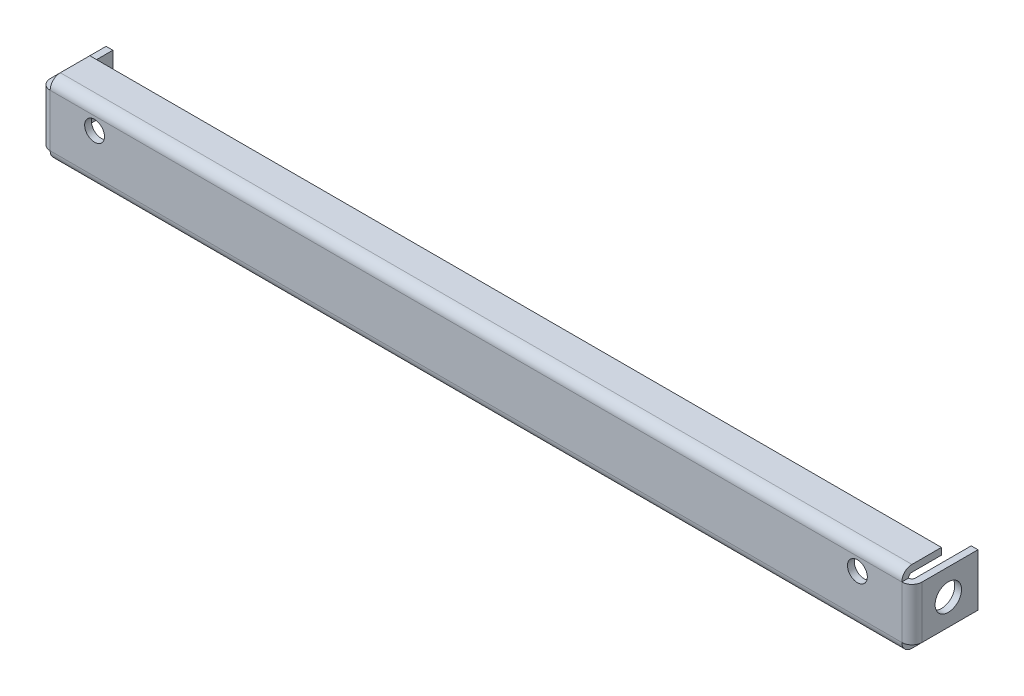
ISO-10303-21;
HEADER;
FILE_DESCRIPTION(('STEP AP214'),'2;1');
FILE_NAME('part.step','',(''),(''),'','','');
FILE_SCHEMA(('AUTOMOTIVE_DESIGN { 1 0 10303 214 1 1 1 1 }'));
ENDSEC;
DATA;
#1=APPLICATION_CONTEXT('core data for automotive mechanical design processes');
#2=APPLICATION_PROTOCOL_DEFINITION('international standard','automotive_design',2000,#1);
#3=PRODUCT_CONTEXT('',#1,'mechanical');
#4=PRODUCT('Part','Part','',(#3));
#5=PRODUCT_RELATED_PRODUCT_CATEGORY('part','',(#4));
#6=PRODUCT_DEFINITION_FORMATION('','',#4);
#7=PRODUCT_DEFINITION_CONTEXT('part definition',#1,'design');
#8=PRODUCT_DEFINITION('design','',#6,#7);
#9=PRODUCT_DEFINITION_SHAPE('','',#8);
#10=(LENGTH_UNIT() NAMED_UNIT(*) SI_UNIT(.MILLI.,.METRE.));
#11=(NAMED_UNIT(*) PLANE_ANGLE_UNIT() SI_UNIT($,.RADIAN.));
#12=(NAMED_UNIT(*) SI_UNIT($,.STERADIAN.) SOLID_ANGLE_UNIT());
#13=UNCERTAINTY_MEASURE_WITH_UNIT(LENGTH_MEASURE(1.E-05),#10,'distance_accuracy_value','');
#14=(GEOMETRIC_REPRESENTATION_CONTEXT(3) GLOBAL_UNCERTAINTY_ASSIGNED_CONTEXT((#13)) GLOBAL_UNIT_ASSIGNED_CONTEXT((#10,
#11,#12)) REPRESENTATION_CONTEXT('',''));
#15=CARTESIAN_POINT('',(0.,0.,0.));
#16=DIRECTION('',(0.,0.,1.));
#17=DIRECTION('',(1.,0.,0.));
#18=AXIS2_PLACEMENT_3D('',#15,#16,#17);
#19=CARTESIAN_POINT('',(104.775,-6.29285,-15.875));
#20=DIRECTION('',(0.,0.,1.));
#21=DIRECTION('',(1.,0.,0.));
#22=AXIS2_PLACEMENT_3D('',#19,#20,#21);
#23=PLANE('',#22);
#24=DIRECTION('',(1.,0.,0.));
#25=VECTOR('',#24,1.);
#26=CARTESIAN_POINT('',(104.775,6.29285,-15.875));
#27=LINE('',#26,#25);
#28=CARTESIAN_POINT('',(104.775,6.29285,-15.875));
#29=VERTEX_POINT('',#28);
#30=CARTESIAN_POINT('',(103.1494,6.29285,-15.875));
#31=VERTEX_POINT('',#30);
#32=EDGE_CURVE('E274',#29,#31,#27,.F.);
#33=ORIENTED_EDGE('',*,*,#32,.F.);
#34=DIRECTION('',(0.,1.,0.));
#35=VECTOR('',#34,1.);
#36=CARTESIAN_POINT('',(104.775,6.29285,-15.875));
#37=LINE('',#36,#35);
#38=CARTESIAN_POINT('',(104.775,-6.29285,-15.875));
#39=VERTEX_POINT('',#38);
#40=EDGE_CURVE('E225',#39,#29,#37,.T.);
#41=ORIENTED_EDGE('',*,*,#40,.F.);
#42=DIRECTION('',(1.,0.,0.));
#43=VECTOR('',#42,1.);
#44=CARTESIAN_POINT('',(104.775,-6.29285,-15.875));
#45=LINE('',#44,#43);
#46=CARTESIAN_POINT('',(103.1494,-6.29285,-15.875));
#47=VERTEX_POINT('',#46);
#48=EDGE_CURVE('E265',#39,#47,#45,.F.);
#49=ORIENTED_EDGE('',*,*,#48,.T.);
#50=DIRECTION('',(0.,1.,0.));
#51=VECTOR('',#50,1.);
#52=CARTESIAN_POINT('',(103.1494,6.29285,-15.875));
#53=LINE('',#52,#51);
#54=EDGE_CURVE('E121',#47,#31,#53,.T.);
#55=ORIENTED_EDGE('',*,*,#54,.T.);
#56=EDGE_LOOP('',(#33,#41,#49,#55));
#57=FACE_BOUND('',#56,.T.);
#58=ADVANCED_FACE('F16',(#57),#23,.F.);
#59=CARTESIAN_POINT('',(-106.099742516144,0.,-8.7376));
#60=DIRECTION('',(-1.,0.,0.));
#61=DIRECTION('',(0.,0.,1.));
#62=AXIS2_PLACEMENT_3D('',#59,#60,#61);
#63=CYLINDRICAL_SURFACE('',#62,3.175);
#64=CARTESIAN_POINT('',(104.775,0.,-8.73760000000001));
#65=DIRECTION('',(-1.,0.,0.));
#66=DIRECTION('',(0.,0.,1.));
#67=AXIS2_PLACEMENT_3D('',#64,#65,#66);
#68=CIRCLE('',#67,3.175);
#69=CARTESIAN_POINT('',(104.775,0.,-5.56260000000001));
#70=VERTEX_POINT('',#69);
#71=EDGE_CURVE('E222',#70,#70,#68,.T.);
#72=ORIENTED_EDGE('',*,*,#71,.F.);
#73=EDGE_LOOP('',(#72));
#74=FACE_BOUND('',#73,.T.);
#75=CARTESIAN_POINT('',(103.1494,0.,-8.73760000000001));
#76=DIRECTION('',(-1.,0.,0.));
#77=DIRECTION('',(0.,0.,1.));
#78=AXIS2_PLACEMENT_3D('',#75,#76,#77);
#79=CIRCLE('',#78,3.175);
#80=CARTESIAN_POINT('',(103.1494,0.,-5.56260000000001));
#81=VERTEX_POINT('',#80);
#82=EDGE_CURVE('E19',#81,#81,#79,.T.);
#83=ORIENTED_EDGE('',*,*,#82,.T.);
#84=EDGE_LOOP('',(#83));
#85=FACE_BOUND('',#84,.T.);
#86=ADVANCED_FACE('F527',(#74,#85),#63,.F.);
#87=CARTESIAN_POINT('',(103.1494,6.29285,-1.38393774617543));
#88=DIRECTION('',(1.,0.,0.));
#89=DIRECTION('',(0.,0.,-1.));
#90=AXIS2_PLACEMENT_3D('',#87,#88,#89);
#91=PLANE('',#90);
#92=ORIENTED_EDGE('',*,*,#82,.F.);
#93=EDGE_LOOP('',(#92));
#94=FACE_BOUND('',#93,.T.);
#95=DIRECTION('',(0.,0.,-1.));
#96=VECTOR('',#95,1.);
#97=CARTESIAN_POINT('',(103.1494,6.29285,-1.38393774617543));
#98=LINE('',#97,#96);
#99=CARTESIAN_POINT('',(103.1494,6.29285,-2.4384));
#100=VERTEX_POINT('',#99);
#101=EDGE_CURVE('E220',#100,#31,#98,.T.);
#102=ORIENTED_EDGE('',*,*,#101,.T.);
#103=ORIENTED_EDGE('',*,*,#54,.F.);
#104=DIRECTION('',(0.,0.,1.));
#105=VECTOR('',#104,1.);
#106=CARTESIAN_POINT('',(103.1494,-6.29285,-1.38393774617543));
#107=LINE('',#106,#105);
#108=CARTESIAN_POINT('',(103.1494,-6.29285,-2.4384));
#109=VERTEX_POINT('',#108);
#110=EDGE_CURVE('E229',#47,#109,#107,.T.);
#111=ORIENTED_EDGE('',*,*,#110,.T.);
#112=DIRECTION('',(0.,-1.,0.));
#113=VECTOR('',#112,1.);
#114=CARTESIAN_POINT('',(103.1494,-6.29285,-2.4384));
#115=LINE('',#114,#113);
#116=EDGE_CURVE('E110',#109,#100,#115,.F.);
#117=ORIENTED_EDGE('',*,*,#116,.T.);
#118=EDGE_LOOP('',(#102,#103,#111,#117));
#119=FACE_BOUND('',#118,.T.);
#120=ADVANCED_FACE('F525',(#94,#119),#91,.F.);
#121=CARTESIAN_POINT('',(-104.775,-8.73125,-9.525));
#122=DIRECTION('',(0.,0.,1.));
#123=DIRECTION('',(0.,-1.,0.));
#124=AXIS2_PLACEMENT_3D('',#121,#122,#123);
#125=PLANE('',#124);
#126=DIRECTION('',(1.,0.,0.));
#127=VECTOR('',#126,1.);
#128=CARTESIAN_POINT('',(-104.775,-7.10565,-9.525));
#129=LINE('',#128,#127);
#130=CARTESIAN_POINT('',(102.3366,-7.10565,-9.525));
#131=VERTEX_POINT('',#130);
#132=CARTESIAN_POINT('',(-102.3366,-7.10565,-9.525));
#133=VERTEX_POINT('',#132);
#134=EDGE_CURVE('E240',#131,#133,#129,.F.);
#135=ORIENTED_EDGE('',*,*,#134,.F.);
#136=DIRECTION('',(0.,-1.,0.));
#137=VECTOR('',#136,1.);
#138=CARTESIAN_POINT('',(102.3366,-8.73125,-9.525));
#139=LINE('',#138,#137);
#140=CARTESIAN_POINT('',(102.3366,-8.73125,-9.525));
#141=VERTEX_POINT('',#140);
#142=EDGE_CURVE('E244',#141,#131,#139,.F.);
#143=ORIENTED_EDGE('',*,*,#142,.F.);
#144=DIRECTION('',(1.,0.,0.));
#145=VECTOR('',#144,1.);
#146=CARTESIAN_POINT('',(-104.775,-8.73125,-9.525));
#147=LINE('',#146,#145);
#148=CARTESIAN_POINT('',(-102.3366,-8.73125,-9.525));
#149=VERTEX_POINT('',#148);
#150=EDGE_CURVE('E216',#141,#149,#147,.F.);
#151=ORIENTED_EDGE('',*,*,#150,.T.);
#152=DIRECTION('',(0.,1.,0.));
#153=VECTOR('',#152,1.);
#154=CARTESIAN_POINT('',(-102.3366,-6.29285,-9.525));
#155=LINE('',#154,#153);
#156=EDGE_CURVE('E266',#149,#133,#155,.T.);
#157=ORIENTED_EDGE('',*,*,#156,.T.);
#158=EDGE_LOOP('',(#135,#143,#151,#157));
#159=FACE_BOUND('',#158,.T.);
#160=ADVANCED_FACE('F521',(#159),#125,.F.);
#161=CARTESIAN_POINT('',(-91.6686,202.143492516144,-5.5626));
#162=DIRECTION('',(0.,1.,0.));
#163=DIRECTION('',(0.,0.,1.));
#164=AXIS2_PLACEMENT_3D('',#161,#162,#163);
#165=CYLINDRICAL_SURFACE('',#164,2.38125);
#166=CARTESIAN_POINT('',(-91.6686,-7.10564999999999,-5.5626));
#167=DIRECTION('',(0.,1.,0.));
#168=DIRECTION('',(0.,0.,1.));
#169=AXIS2_PLACEMENT_3D('',#166,#167,#168);
#170=CIRCLE('',#169,2.38125);
#171=CARTESIAN_POINT('',(-91.6686,-7.10564999999999,-3.18135));
#172=VERTEX_POINT('',#171);
#173=EDGE_CURVE('E235',#172,#172,#170,.F.);
#174=ORIENTED_EDGE('',*,*,#173,.F.);
#175=EDGE_LOOP('',(#174));
#176=FACE_BOUND('',#175,.T.);
#177=CARTESIAN_POINT('',(-91.6686,-8.73125,-5.5626));
#178=DIRECTION('',(0.,1.,0.));
#179=DIRECTION('',(0.,0.,1.));
#180=AXIS2_PLACEMENT_3D('',#177,#178,#179);
#181=CIRCLE('',#180,2.38125);
#182=CARTESIAN_POINT('',(-91.6686,-8.73125,-3.18135));
#183=VERTEX_POINT('',#182);
#184=EDGE_CURVE('E210',#183,#183,#181,.F.);
#185=ORIENTED_EDGE('',*,*,#184,.T.);
#186=EDGE_LOOP('',(#185));
#187=FACE_BOUND('',#186,.T.);
#188=ADVANCED_FACE('F514',(#176,#187),#165,.F.);
#189=CARTESIAN_POINT('',(91.6686,202.143492516144,-5.5626));
#190=DIRECTION('',(0.,1.,0.));
#191=DIRECTION('',(0.,0.,1.));
#192=AXIS2_PLACEMENT_3D('',#189,#190,#191);
#193=CYLINDRICAL_SURFACE('',#192,2.38125);
#194=CARTESIAN_POINT('',(91.6686,-7.10564999999999,-5.5626));
#195=DIRECTION('',(0.,1.,0.));
#196=DIRECTION('',(0.,0.,1.));
#197=AXIS2_PLACEMENT_3D('',#194,#195,#196);
#198=CIRCLE('',#197,2.38125);
#199=CARTESIAN_POINT('',(91.6686,-7.10564999999999,-3.18135));
#200=VERTEX_POINT('',#199);
#201=EDGE_CURVE('E238',#200,#200,#198,.F.);
#202=ORIENTED_EDGE('',*,*,#201,.F.);
#203=EDGE_LOOP('',(#202));
#204=FACE_BOUND('',#203,.T.);
#205=CARTESIAN_POINT('',(91.6686,-8.73125,-5.5626));
#206=DIRECTION('',(0.,1.,0.));
#207=DIRECTION('',(0.,0.,1.));
#208=AXIS2_PLACEMENT_3D('',#205,#206,#207);
#209=CIRCLE('',#208,2.38125);
#210=CARTESIAN_POINT('',(91.6686,-8.73125,-3.18135));
#211=VERTEX_POINT('',#210);
#212=EDGE_CURVE('E207',#211,#211,#209,.F.);
#213=ORIENTED_EDGE('',*,*,#212,.T.);
#214=EDGE_LOOP('',(#213));
#215=FACE_BOUND('',#214,.T.);
#216=ADVANCED_FACE('F504',(#204,#215),#193,.F.);
#217=CARTESIAN_POINT('',(-104.775,-7.10565,0.));
#218=DIRECTION('',(0.,1.,0.));
#219=DIRECTION('',(0.,0.,1.));
#220=AXIS2_PLACEMENT_3D('',#217,#218,#219);
#221=PLANE('',#220);
#222=ORIENTED_EDGE('',*,*,#173,.T.);
#223=EDGE_LOOP('',(#222));
#224=FACE_BOUND('',#223,.T.);
#225=ORIENTED_EDGE('',*,*,#201,.T.);
#226=EDGE_LOOP('',(#225));
#227=FACE_BOUND('',#226,.T.);
#228=DIRECTION('',(0.,0.,-1.));
#229=VECTOR('',#228,1.);
#230=CARTESIAN_POINT('',(102.3366,-7.10565,-2.4384));
#231=LINE('',#230,#229);
#232=CARTESIAN_POINT('',(102.3366,-7.10565,-2.4384));
#233=VERTEX_POINT('',#232);
#234=EDGE_CURVE('E345',#131,#233,#231,.F.);
#235=ORIENTED_EDGE('',*,*,#234,.F.);
#236=ORIENTED_EDGE('',*,*,#134,.T.);
#237=DIRECTION('',(0.,0.,-1.));
#238=VECTOR('',#237,1.);
#239=CARTESIAN_POINT('',(-102.3366,-7.10565,-2.4384));
#240=LINE('',#239,#238);
#241=CARTESIAN_POINT('',(-102.3366,-7.10565,-2.4384));
#242=VERTEX_POINT('',#241);
#243=EDGE_CURVE('E217',#133,#242,#240,.F.);
#244=ORIENTED_EDGE('',*,*,#243,.T.);
#245=DIRECTION('',(-1.,0.,0.));
#246=VECTOR('',#245,1.);
#247=CARTESIAN_POINT('',(-104.775,-7.10565,-2.4384));
#248=LINE('',#247,#246);
#249=EDGE_CURVE('E263',#242,#233,#248,.F.);
#250=ORIENTED_EDGE('',*,*,#249,.T.);
#251=EDGE_LOOP('',(#235,#236,#244,#250));
#252=FACE_BOUND('',#251,.T.);
#253=ADVANCED_FACE('F502',(#224,#227,#252),#221,.T.);
#254=CARTESIAN_POINT('',(-104.775,6.29285,-15.875));
#255=DIRECTION('',(0.,0.,1.));
#256=DIRECTION('',(1.,0.,0.));
#257=AXIS2_PLACEMENT_3D('',#254,#255,#256);
#258=PLANE('',#257);
#259=DIRECTION('',(1.,0.,0.));
#260=VECTOR('',#259,1.);
#261=CARTESIAN_POINT('',(-104.775,-6.29285,-15.875));
#262=LINE('',#261,#260);
#263=CARTESIAN_POINT('',(-104.775,-6.29285,-15.875));
#264=VERTEX_POINT('',#263);
#265=CARTESIAN_POINT('',(-103.1494,-6.29285,-15.875));
#266=VERTEX_POINT('',#265);
#267=EDGE_CURVE('E237',#264,#266,#262,.T.);
#268=ORIENTED_EDGE('',*,*,#267,.F.);
#269=DIRECTION('',(0.,1.,0.));
#270=VECTOR('',#269,1.);
#271=CARTESIAN_POINT('',(-104.775,6.29285,-15.875));
#272=LINE('',#271,#270);
#273=CARTESIAN_POINT('',(-104.775,6.29285,-15.875));
#274=VERTEX_POINT('',#273);
#275=EDGE_CURVE('E201',#264,#274,#272,.T.);
#276=ORIENTED_EDGE('',*,*,#275,.T.);
#277=DIRECTION('',(1.,0.,0.));
#278=VECTOR('',#277,1.);
#279=CARTESIAN_POINT('',(-104.775,6.29285,-15.875));
#280=LINE('',#279,#278);
#281=CARTESIAN_POINT('',(-103.1494,6.29285,-15.875));
#282=VERTEX_POINT('',#281);
#283=EDGE_CURVE('E342',#274,#282,#280,.T.);
#284=ORIENTED_EDGE('',*,*,#283,.T.);
#285=DIRECTION('',(0.,1.,0.));
#286=VECTOR('',#285,1.);
#287=CARTESIAN_POINT('',(-103.1494,6.29285,-15.875));
#288=LINE('',#287,#286);
#289=EDGE_CURVE('E234',#266,#282,#288,.T.);
#290=ORIENTED_EDGE('',*,*,#289,.F.);
#291=EDGE_LOOP('',(#268,#276,#284,#290));
#292=FACE_BOUND('',#291,.T.);
#293=ADVANCED_FACE('F437',(#292),#258,.F.);
#294=CARTESIAN_POINT('',(106.099742516144,0.,-8.7376));
#295=DIRECTION('',(1.,0.,0.));
#296=DIRECTION('',(0.,0.,-1.));
#297=AXIS2_PLACEMENT_3D('',#294,#295,#296);
#298=CYLINDRICAL_SURFACE('',#297,3.175);
#299=CARTESIAN_POINT('',(-103.1494,0.,-8.73760000000001));
#300=DIRECTION('',(1.,0.,0.));
#301=DIRECTION('',(0.,0.,-1.));
#302=AXIS2_PLACEMENT_3D('',#299,#300,#301);
#303=CIRCLE('',#302,3.175);
#304=CARTESIAN_POINT('',(-103.1494,0.,-11.9126));
#305=VERTEX_POINT('',#304);
#306=EDGE_CURVE('E230',#305,#305,#303,.F.);
#307=ORIENTED_EDGE('',*,*,#306,.F.);
#308=EDGE_LOOP('',(#307));
#309=FACE_BOUND('',#308,.T.);
#310=CARTESIAN_POINT('',(-104.775,0.,-8.73760000000001));
#311=DIRECTION('',(1.,0.,0.));
#312=DIRECTION('',(0.,0.,-1.));
#313=AXIS2_PLACEMENT_3D('',#310,#311,#312);
#314=CIRCLE('',#313,3.175);
#315=CARTESIAN_POINT('',(-104.775,0.,-11.9126));
#316=VERTEX_POINT('',#315);
#317=EDGE_CURVE('E194',#316,#316,#314,.F.);
#318=ORIENTED_EDGE('',*,*,#317,.T.);
#319=EDGE_LOOP('',(#318));
#320=FACE_BOUND('',#319,.T.);
#321=ADVANCED_FACE('F512',(#309,#320),#298,.F.);
#322=CARTESIAN_POINT('',(-103.1494,6.29285,-1.38393774617543));
#323=DIRECTION('',(1.,0.,0.));
#324=DIRECTION('',(0.,0.,-1.));
#325=AXIS2_PLACEMENT_3D('',#322,#323,#324);
#326=PLANE('',#325);
#327=ORIENTED_EDGE('',*,*,#306,.T.);
#328=EDGE_LOOP('',(#327));
#329=FACE_BOUND('',#328,.T.);
#330=DIRECTION('',(0.,0.,1.));
#331=VECTOR('',#330,1.);
#332=CARTESIAN_POINT('',(-103.1494,-6.29285,-15.875));
#333=LINE('',#332,#331);
#334=CARTESIAN_POINT('',(-103.1494,-6.29285,-2.4384));
#335=VERTEX_POINT('',#334);
#336=EDGE_CURVE('E192',#335,#266,#333,.F.);
#337=ORIENTED_EDGE('',*,*,#336,.T.);
#338=ORIENTED_EDGE('',*,*,#289,.T.);
#339=DIRECTION('',(0.,0.,-1.));
#340=VECTOR('',#339,1.);
#341=CARTESIAN_POINT('',(-103.1494,6.29285,-1.38393774617543));
#342=LINE('',#341,#340);
#343=CARTESIAN_POINT('',(-103.1494,6.29285,-2.4384));
#344=VERTEX_POINT('',#343);
#345=EDGE_CURVE('E202',#282,#344,#342,.F.);
#346=ORIENTED_EDGE('',*,*,#345,.T.);
#347=DIRECTION('',(0.,1.,0.));
#348=VECTOR('',#347,1.);
#349=CARTESIAN_POINT('',(-103.1494,6.29285,-2.4384));
#350=LINE('',#349,#348);
#351=EDGE_CURVE('E384',#344,#335,#350,.F.);
#352=ORIENTED_EDGE('',*,*,#351,.T.);
#353=EDGE_LOOP('',(#337,#338,#346,#352));
#354=FACE_BOUND('',#353,.T.);
#355=ADVANCED_FACE('F441',(#329,#354),#326,.T.);
#356=CARTESIAN_POINT('',(-104.775,8.73125,-9.525));
#357=DIRECTION('',(0.,0.,-1.));
#358=DIRECTION('',(0.,1.,0.));
#359=AXIS2_PLACEMENT_3D('',#356,#357,#358);
#360=PLANE('',#359);
#361=DIRECTION('',(0.,1.,0.));
#362=VECTOR('',#361,1.);
#363=CARTESIAN_POINT('',(102.3366,8.73125,-9.525));
#364=LINE('',#363,#362);
#365=CARTESIAN_POINT('',(102.3366,8.73125,-9.525));
#366=VERTEX_POINT('',#365);
#367=CARTESIAN_POINT('',(102.3366,7.10565,-9.525));
#368=VERTEX_POINT('',#367);
#369=EDGE_CURVE('E385',#366,#368,#364,.F.);
#370=ORIENTED_EDGE('',*,*,#369,.T.);
#371=DIRECTION('',(1.,0.,0.));
#372=VECTOR('',#371,1.);
#373=CARTESIAN_POINT('',(-104.775,7.10565,-9.525));
#374=LINE('',#373,#372);
#375=CARTESIAN_POINT('',(-102.3366,7.10565,-9.525));
#376=VERTEX_POINT('',#375);
#377=EDGE_CURVE('E381',#376,#368,#374,.T.);
#378=ORIENTED_EDGE('',*,*,#377,.F.);
#379=DIRECTION('',(0.,1.,0.));
#380=VECTOR('',#379,1.);
#381=CARTESIAN_POINT('',(-102.3366,8.73125,-9.525));
#382=LINE('',#381,#380);
#383=CARTESIAN_POINT('',(-102.3366,8.73125,-9.525));
#384=VERTEX_POINT('',#383);
#385=EDGE_CURVE('E233',#376,#384,#382,.T.);
#386=ORIENTED_EDGE('',*,*,#385,.T.);
#387=DIRECTION('',(1.,0.,0.));
#388=VECTOR('',#387,1.);
#389=CARTESIAN_POINT('',(-104.775,8.73125,-9.525));
#390=LINE('',#389,#388);
#391=EDGE_CURVE('E154',#384,#366,#390,.T.);
#392=ORIENTED_EDGE('',*,*,#391,.T.);
#393=EDGE_LOOP('',(#370,#378,#386,#392));
#394=FACE_BOUND('',#393,.T.);
#395=ADVANCED_FACE('F561',(#394),#360,.T.);
#396=CARTESIAN_POINT('',(-104.775,7.10565,0.));
#397=DIRECTION('',(0.,-1.,0.));
#398=DIRECTION('',(0.,0.,-1.));
#399=AXIS2_PLACEMENT_3D('',#396,#397,#398);
#400=PLANE('',#399);
#401=DIRECTION('',(0.,0.,-1.));
#402=VECTOR('',#401,1.);
#403=CARTESIAN_POINT('',(102.3366,7.10565,-2.4384));
#404=LINE('',#403,#402);
#405=CARTESIAN_POINT('',(102.3366,7.10565,-2.4384));
#406=VERTEX_POINT('',#405);
#407=EDGE_CURVE('E184',#406,#368,#404,.T.);
#408=ORIENTED_EDGE('',*,*,#407,.F.);
#409=DIRECTION('',(-1.,0.,0.));
#410=VECTOR('',#409,1.);
#411=CARTESIAN_POINT('',(-104.775,7.10565,-2.4384));
#412=LINE('',#411,#410);
#413=CARTESIAN_POINT('',(-102.3366,7.10565,-2.4384));
#414=VERTEX_POINT('',#413);
#415=EDGE_CURVE('E278',#406,#414,#412,.T.);
#416=ORIENTED_EDGE('',*,*,#415,.T.);
#417=DIRECTION('',(0.,0.,-1.));
#418=VECTOR('',#417,1.);
#419=CARTESIAN_POINT('',(-102.3366,7.10565,-2.4384));
#420=LINE('',#419,#418);
#421=EDGE_CURVE('E156',#414,#376,#420,.T.);
#422=ORIENTED_EDGE('',*,*,#421,.T.);
#423=ORIENTED_EDGE('',*,*,#377,.T.);
#424=EDGE_LOOP('',(#408,#416,#422,#423));
#425=FACE_BOUND('',#424,.T.);
#426=ADVANCED_FACE('F558',(#425),#400,.T.);
#427=CARTESIAN_POINT('',(-102.3366,6.29285,-2.4384));
#428=DIRECTION('',(0.,1.,0.));
#429=DIRECTION('',(0.,0.,1.));
#430=AXIS2_PLACEMENT_3D('',#427,#428,#429);
#431=CYLINDRICAL_SURFACE('',#430,0.8128);
#432=CARTESIAN_POINT('',(-102.3366,-6.29285,-2.4384));
#433=DIRECTION('',(0.,1.,0.));
#434=DIRECTION('',(0.,0.,1.));
#435=AXIS2_PLACEMENT_3D('',#432,#433,#434);
#436=CIRCLE('',#435,0.8128);
#437=CARTESIAN_POINT('',(-102.3366,-6.29285,-1.6256));
#438=VERTEX_POINT('',#437);
#439=EDGE_CURVE('E189',#438,#335,#436,.F.);
#440=ORIENTED_EDGE('',*,*,#439,.T.);
#441=ORIENTED_EDGE('',*,*,#351,.F.);
#442=CARTESIAN_POINT('',(-102.3366,6.29285,-2.4384));
#443=DIRECTION('',(0.,1.,0.));
#444=DIRECTION('',(0.,0.,1.));
#445=AXIS2_PLACEMENT_3D('',#442,#443,#444);
#446=CIRCLE('',#445,0.8128);
#447=CARTESIAN_POINT('',(-102.3366,6.29285,-1.6256));
#448=VERTEX_POINT('',#447);
#449=EDGE_CURVE('E199',#344,#448,#446,.T.);
#450=ORIENTED_EDGE('',*,*,#449,.T.);
#451=DIRECTION('',(0.,1.,0.));
#452=VECTOR('',#451,1.);
#453=CARTESIAN_POINT('',(-102.3366,8.73125,-1.6256));
#454=LINE('',#453,#452);
#455=EDGE_CURVE('E392',#438,#448,#454,.T.);
#456=ORIENTED_EDGE('',*,*,#455,.F.);
#457=EDGE_LOOP('',(#440,#441,#450,#456));
#458=FACE_BOUND('',#457,.T.);
#459=ADVANCED_FACE('F492',(#458),#431,.F.);
#460=CARTESIAN_POINT('',(-104.775,6.29285,-2.4384));
#461=DIRECTION('',(-1.,0.,0.));
#462=DIRECTION('',(0.,0.,1.));
#463=AXIS2_PLACEMENT_3D('',#460,#461,#462);
#464=CYLINDRICAL_SURFACE('',#463,0.8128);
#465=ORIENTED_EDGE('',*,*,#415,.F.);
#466=CARTESIAN_POINT('',(102.3366,6.29285,-2.4384));
#467=DIRECTION('',(-1.,0.,0.));
#468=DIRECTION('',(0.,0.,1.));
#469=AXIS2_PLACEMENT_3D('',#466,#467,#468);
#470=CIRCLE('',#469,0.8128);
#471=CARTESIAN_POINT('',(102.3366,6.29285,-1.6256));
#472=VERTEX_POINT('',#471);
#473=EDGE_CURVE('E181',#472,#406,#470,.T.);
#474=ORIENTED_EDGE('',*,*,#473,.F.);
#475=DIRECTION('',(-1.,0.,0.));
#476=VECTOR('',#475,1.);
#477=CARTESIAN_POINT('',(-104.775,6.29285,-1.6256));
#478=LINE('',#477,#476);
#479=EDGE_CURVE('E388',#448,#472,#478,.F.);
#480=ORIENTED_EDGE('',*,*,#479,.F.);
#481=CARTESIAN_POINT('',(-102.3366,6.29285,-2.4384));
#482=DIRECTION('',(-1.,0.,0.));
#483=DIRECTION('',(0.,0.,1.));
#484=AXIS2_PLACEMENT_3D('',#481,#482,#483);
#485=CIRCLE('',#484,0.8128);
#486=EDGE_CURVE('E186',#448,#414,#485,.T.);
#487=ORIENTED_EDGE('',*,*,#486,.T.);
#488=EDGE_LOOP('',(#465,#474,#480,#487));
#489=FACE_BOUND('',#488,.T.);
#490=ADVANCED_FACE('F497',(#489),#464,.F.);
#491=CARTESIAN_POINT('',(102.3366,-6.29285,-2.4384));
#492=DIRECTION('',(0.,-1.,0.));
#493=DIRECTION('',(0.,0.,-1.));
#494=AXIS2_PLACEMENT_3D('',#491,#492,#493);
#495=CYLINDRICAL_SURFACE('',#494,0.8128);
#496=CARTESIAN_POINT('',(102.3366,6.29285,-2.4384));
#497=DIRECTION('',(0.,-1.,0.));
#498=DIRECTION('',(0.,0.,-1.));
#499=AXIS2_PLACEMENT_3D('',#496,#497,#498);
#500=CIRCLE('',#499,0.8128);
#501=EDGE_CURVE('E218',#472,#100,#500,.F.);
#502=ORIENTED_EDGE('',*,*,#501,.T.);
#503=ORIENTED_EDGE('',*,*,#116,.F.);
#504=CARTESIAN_POINT('',(102.3366,-6.29285,-2.4384));
#505=DIRECTION('',(0.,-1.,0.));
#506=DIRECTION('',(0.,0.,-1.));
#507=AXIS2_PLACEMENT_3D('',#504,#505,#506);
#508=CIRCLE('',#507,0.8128);
#509=CARTESIAN_POINT('',(102.3366,-6.29285,-1.6256));
#510=VERTEX_POINT('',#509);
#511=EDGE_CURVE('E226',#109,#510,#508,.T.);
#512=ORIENTED_EDGE('',*,*,#511,.T.);
#513=DIRECTION('',(0.,1.,0.));
#514=VECTOR('',#513,1.);
#515=CARTESIAN_POINT('',(102.3366,8.73125,-1.6256));
#516=LINE('',#515,#514);
#517=EDGE_CURVE('E391',#472,#510,#516,.F.);
#518=ORIENTED_EDGE('',*,*,#517,.F.);
#519=EDGE_LOOP('',(#502,#503,#512,#518));
#520=FACE_BOUND('',#519,.T.);
#521=ADVANCED_FACE('F545',(#520),#495,.F.);
#522=CARTESIAN_POINT('',(-104.775,-6.29285,-2.4384));
#523=DIRECTION('',(-1.,0.,0.));
#524=DIRECTION('',(0.,0.,1.));
#525=AXIS2_PLACEMENT_3D('',#522,#523,#524);
#526=CYLINDRICAL_SURFACE('',#525,0.8128);
#527=DIRECTION('',(-1.,0.,0.));
#528=VECTOR('',#527,1.);
#529=CARTESIAN_POINT('',(-104.775,-6.29285,-1.6256));
#530=LINE('',#529,#528);
#531=EDGE_CURVE('E180',#510,#438,#530,.T.);
#532=ORIENTED_EDGE('',*,*,#531,.F.);
#533=CARTESIAN_POINT('',(102.3366,-6.29285,-2.4384));
#534=DIRECTION('',(-1.,0.,0.));
#535=DIRECTION('',(0.,0.,1.));
#536=AXIS2_PLACEMENT_3D('',#533,#534,#535);
#537=CIRCLE('',#536,0.8128);
#538=EDGE_CURVE('E203',#233,#510,#537,.T.);
#539=ORIENTED_EDGE('',*,*,#538,.F.);
#540=ORIENTED_EDGE('',*,*,#249,.F.);
#541=CARTESIAN_POINT('',(-102.3366,-6.29285,-2.4384));
#542=DIRECTION('',(-1.,0.,0.));
#543=DIRECTION('',(0.,0.,1.));
#544=AXIS2_PLACEMENT_3D('',#541,#542,#543);
#545=CIRCLE('',#544,0.8128);
#546=EDGE_CURVE('E214',#242,#438,#545,.T.);
#547=ORIENTED_EDGE('',*,*,#546,.T.);
#548=EDGE_LOOP('',(#532,#539,#540,#547));
#549=FACE_BOUND('',#548,.T.);
#550=ADVANCED_FACE('F501',(#549),#526,.F.);
#551=CARTESIAN_POINT('',(104.775,-6.29285,-1.38393774617543));
#552=DIRECTION('',(0.,1.,0.));
#553=DIRECTION('',(0.,0.,1.));
#554=AXIS2_PLACEMENT_3D('',#551,#552,#553);
#555=PLANE('',#554);
#556=CARTESIAN_POINT('',(102.3366,-6.29285,-2.4384));
#557=DIRECTION('',(0.,-1.,0.));
#558=DIRECTION('',(0.,0.,-1.));
#559=AXIS2_PLACEMENT_3D('',#556,#557,#558);
#560=CIRCLE('',#559,2.4384);
#561=CARTESIAN_POINT('',(102.3366,-6.29285,0.));
#562=VERTEX_POINT('',#561);
#563=CARTESIAN_POINT('',(104.775,-6.29285,-2.4384));
#564=VERTEX_POINT('',#563);
#565=EDGE_CURVE('E178',#562,#564,#560,.F.);
#566=ORIENTED_EDGE('',*,*,#565,.F.);
#567=DIRECTION('',(0.,0.,-1.));
#568=VECTOR('',#567,1.);
#569=CARTESIAN_POINT('',(102.3366,-6.29285,-2.4384));
#570=LINE('',#569,#568);
#571=EDGE_CURVE('E206',#510,#562,#570,.F.);
#572=ORIENTED_EDGE('',*,*,#571,.F.);
#573=ORIENTED_EDGE('',*,*,#511,.F.);
#574=ORIENTED_EDGE('',*,*,#110,.F.);
#575=ORIENTED_EDGE('',*,*,#48,.F.);
#576=DIRECTION('',(0.,0.,-1.));
#577=VECTOR('',#576,1.);
#578=CARTESIAN_POINT('',(104.775,-6.29285,-1.38393774617543));
#579=LINE('',#578,#577);
#580=EDGE_CURVE('E228',#564,#39,#579,.T.);
#581=ORIENTED_EDGE('',*,*,#580,.F.);
#582=EDGE_LOOP('',(#566,#572,#573,#574,#575,#581));
#583=FACE_BOUND('',#582,.T.);
#584=ADVANCED_FACE('F472',(#583),#555,.F.);
#585=CARTESIAN_POINT('',(104.775,6.29285,-1.38393774617543));
#586=DIRECTION('',(1.,0.,0.));
#587=DIRECTION('',(0.,0.,-1.));
#588=AXIS2_PLACEMENT_3D('',#585,#586,#587);
#589=PLANE('',#588);
#590=ORIENTED_EDGE('',*,*,#71,.T.);
#591=EDGE_LOOP('',(#590));
#592=FACE_BOUND('',#591,.T.);
#593=ORIENTED_EDGE('',*,*,#580,.T.);
#594=ORIENTED_EDGE('',*,*,#40,.T.);
#595=DIRECTION('',(0.,0.,-1.));
#596=VECTOR('',#595,1.);
#597=CARTESIAN_POINT('',(104.775,6.29285,-1.38393774617543));
#598=LINE('',#597,#596);
#599=CARTESIAN_POINT('',(104.775,6.29285,-2.4384));
#600=VERTEX_POINT('',#599);
#601=EDGE_CURVE('E221',#29,#600,#598,.F.);
#602=ORIENTED_EDGE('',*,*,#601,.T.);
#603=DIRECTION('',(0.,-1.,0.));
#604=VECTOR('',#603,1.);
#605=CARTESIAN_POINT('',(104.775,-6.29285,-2.4384));
#606=LINE('',#605,#604);
#607=EDGE_CURVE('E177',#564,#600,#606,.F.);
#608=ORIENTED_EDGE('',*,*,#607,.F.);
#609=EDGE_LOOP('',(#593,#594,#602,#608));
#610=FACE_BOUND('',#609,.T.);
#611=ADVANCED_FACE('F595',(#592,#610),#589,.T.);
#612=CARTESIAN_POINT('',(104.775,6.29285,-1.38393774617543));
#613=DIRECTION('',(0.,-1.,0.));
#614=DIRECTION('',(0.,0.,-1.));
#615=AXIS2_PLACEMENT_3D('',#612,#613,#614);
#616=PLANE('',#615);
#617=ORIENTED_EDGE('',*,*,#501,.F.);
#618=DIRECTION('',(0.,0.,-1.));
#619=VECTOR('',#618,1.);
#620=CARTESIAN_POINT('',(102.3366,6.29285,-2.4384));
#621=LINE('',#620,#619);
#622=CARTESIAN_POINT('',(102.3366,6.29285,0.));
#623=VERTEX_POINT('',#622);
#624=EDGE_CURVE('E185',#623,#472,#621,.T.);
#625=ORIENTED_EDGE('',*,*,#624,.F.);
#626=CARTESIAN_POINT('',(102.3366,6.29285,-2.4384));
#627=DIRECTION('',(0.,-1.,0.));
#628=DIRECTION('',(0.,0.,-1.));
#629=AXIS2_PLACEMENT_3D('',#626,#627,#628);
#630=CIRCLE('',#629,2.4384);
#631=EDGE_CURVE('E175',#600,#623,#630,.T.);
#632=ORIENTED_EDGE('',*,*,#631,.F.);
#633=ORIENTED_EDGE('',*,*,#601,.F.);
#634=ORIENTED_EDGE('',*,*,#32,.T.);
#635=ORIENTED_EDGE('',*,*,#101,.F.);
#636=EDGE_LOOP('',(#617,#625,#632,#633,#634,#635));
#637=FACE_BOUND('',#636,.T.);
#638=ADVANCED_FACE('F541',(#637),#616,.F.);
#639=CARTESIAN_POINT('',(-102.3366,-6.29285,-2.4384));
#640=DIRECTION('',(1.,0.,0.));
#641=DIRECTION('',(0.,0.,-1.));
#642=AXIS2_PLACEMENT_3D('',#639,#640,#641);
#643=PLANE('',#642);
#644=ORIENTED_EDGE('',*,*,#546,.F.);
#645=ORIENTED_EDGE('',*,*,#243,.F.);
#646=ORIENTED_EDGE('',*,*,#156,.F.);
#647=DIRECTION('',(0.,0.,1.));
#648=VECTOR('',#647,1.);
#649=CARTESIAN_POINT('',(-102.3366,-8.73125,0.));
#650=LINE('',#649,#648);
#651=CARTESIAN_POINT('',(-102.3366,-8.73125,-2.4384));
#652=VERTEX_POINT('',#651);
#653=EDGE_CURVE('E213',#149,#652,#650,.T.);
#654=ORIENTED_EDGE('',*,*,#653,.T.);
#655=CARTESIAN_POINT('',(-102.3366,-6.29285,-2.4384));
#656=DIRECTION('',(-1.,0.,0.));
#657=DIRECTION('',(0.,0.,1.));
#658=AXIS2_PLACEMENT_3D('',#655,#656,#657);
#659=CIRCLE('',#658,2.4384);
#660=CARTESIAN_POINT('',(-102.3366,-6.29285,0.));
#661=VERTEX_POINT('',#660);
#662=EDGE_CURVE('E173',#661,#652,#659,.F.);
#663=ORIENTED_EDGE('',*,*,#662,.F.);
#664=DIRECTION('',(0.,0.,1.));
#665=VECTOR('',#664,1.);
#666=CARTESIAN_POINT('',(-102.3366,-6.29285,-15.875));
#667=LINE('',#666,#665);
#668=EDGE_CURVE('E193',#661,#438,#667,.F.);
#669=ORIENTED_EDGE('',*,*,#668,.T.);
#670=EDGE_LOOP('',(#644,#645,#646,#654,#663,#669));
#671=FACE_BOUND('',#670,.T.);
#672=ADVANCED_FACE('F458',(#671),#643,.F.);
#673=CARTESIAN_POINT('',(-104.775,-8.73125,0.));
#674=DIRECTION('',(0.,1.,0.));
#675=DIRECTION('',(0.,0.,1.));
#676=AXIS2_PLACEMENT_3D('',#673,#674,#675);
#677=PLANE('',#676);
#678=ORIENTED_EDGE('',*,*,#212,.F.);
#679=EDGE_LOOP('',(#678));
#680=FACE_BOUND('',#679,.T.);
#681=ORIENTED_EDGE('',*,*,#184,.F.);
#682=EDGE_LOOP('',(#681));
#683=FACE_BOUND('',#682,.T.);
#684=ORIENTED_EDGE('',*,*,#653,.F.);
#685=ORIENTED_EDGE('',*,*,#150,.F.);
#686=DIRECTION('',(0.,0.,-1.));
#687=VECTOR('',#686,1.);
#688=CARTESIAN_POINT('',(102.3366,-8.73125,-2.4384));
#689=LINE('',#688,#687);
#690=CARTESIAN_POINT('',(102.3366,-8.73125,-2.4384));
#691=VERTEX_POINT('',#690);
#692=EDGE_CURVE('E348',#691,#141,#689,.T.);
#693=ORIENTED_EDGE('',*,*,#692,.F.);
#694=DIRECTION('',(-1.,0.,0.));
#695=VECTOR('',#694,1.);
#696=CARTESIAN_POINT('',(-104.775,-8.73125,-2.4384));
#697=LINE('',#696,#695);
#698=EDGE_CURVE('E172',#652,#691,#697,.F.);
#699=ORIENTED_EDGE('',*,*,#698,.F.);
#700=EDGE_LOOP('',(#684,#685,#693,#699));
#701=FACE_BOUND('',#700,.T.);
#702=ADVANCED_FACE('F465',(#680,#683,#701),#677,.F.);
#703=CARTESIAN_POINT('',(102.3366,6.29285,-2.4384));
#704=DIRECTION('',(1.,0.,0.));
#705=DIRECTION('',(0.,0.,-1.));
#706=AXIS2_PLACEMENT_3D('',#703,#704,#705);
#707=PLANE('',#706);
#708=ORIENTED_EDGE('',*,*,#142,.T.);
#709=ORIENTED_EDGE('',*,*,#234,.T.);
#710=ORIENTED_EDGE('',*,*,#538,.T.);
#711=ORIENTED_EDGE('',*,*,#571,.T.);
#712=CARTESIAN_POINT('',(102.3366,-6.29285,-2.4384));
#713=DIRECTION('',(-1.,0.,0.));
#714=DIRECTION('',(0.,0.,1.));
#715=AXIS2_PLACEMENT_3D('',#712,#713,#714);
#716=CIRCLE('',#715,2.4384);
#717=EDGE_CURVE('E169',#691,#562,#716,.T.);
#718=ORIENTED_EDGE('',*,*,#717,.F.);
#719=ORIENTED_EDGE('',*,*,#692,.T.);
#720=EDGE_LOOP('',(#708,#709,#710,#711,#718,#719));
#721=FACE_BOUND('',#720,.T.);
#722=ADVANCED_FACE('F467',(#721),#707,.T.);
#723=CARTESIAN_POINT('',(-104.775,6.29285,-1.38393774617543));
#724=DIRECTION('',(0.,-1.,0.));
#725=DIRECTION('',(0.,0.,-1.));
#726=AXIS2_PLACEMENT_3D('',#723,#724,#725);
#727=PLANE('',#726);
#728=CARTESIAN_POINT('',(-102.3366,6.29285,-2.4384));
#729=DIRECTION('',(0.,1.,0.));
#730=DIRECTION('',(0.,0.,1.));
#731=AXIS2_PLACEMENT_3D('',#728,#729,#730);
#732=CIRCLE('',#731,2.4384);
#733=CARTESIAN_POINT('',(-102.3366,6.29285,0.));
#734=VERTEX_POINT('',#733);
#735=CARTESIAN_POINT('',(-104.775,6.29285,-2.4384));
#736=VERTEX_POINT('',#735);
#737=EDGE_CURVE('E167',#734,#736,#732,.F.);
#738=ORIENTED_EDGE('',*,*,#737,.F.);
#739=DIRECTION('',(0.,0.,-1.));
#740=VECTOR('',#739,1.);
#741=CARTESIAN_POINT('',(-102.3366,6.29285,-2.4384));
#742=LINE('',#741,#740);
#743=EDGE_CURVE('E34',#734,#448,#742,.T.);
#744=ORIENTED_EDGE('',*,*,#743,.T.);
#745=ORIENTED_EDGE('',*,*,#449,.F.);
#746=ORIENTED_EDGE('',*,*,#345,.F.);
#747=ORIENTED_EDGE('',*,*,#283,.F.);
#748=DIRECTION('',(0.,0.,-1.));
#749=VECTOR('',#748,1.);
#750=CARTESIAN_POINT('',(-104.775,6.29285,-1.38393774617543));
#751=LINE('',#750,#749);
#752=EDGE_CURVE('E198',#274,#736,#751,.F.);
#753=ORIENTED_EDGE('',*,*,#752,.T.);
#754=EDGE_LOOP('',(#738,#744,#745,#746,#747,#753));
#755=FACE_BOUND('',#754,.T.);
#756=ADVANCED_FACE('F488',(#755),#727,.F.);
#757=CARTESIAN_POINT('',(-104.775,6.29285,-1.38393774617543));
#758=DIRECTION('',(1.,0.,0.));
#759=DIRECTION('',(0.,0.,-1.));
#760=AXIS2_PLACEMENT_3D('',#757,#758,#759);
#761=PLANE('',#760);
#762=ORIENTED_EDGE('',*,*,#317,.F.);
#763=EDGE_LOOP('',(#762));
#764=FACE_BOUND('',#763,.T.);
#765=ORIENTED_EDGE('',*,*,#752,.F.);
#766=ORIENTED_EDGE('',*,*,#275,.F.);
#767=DIRECTION('',(0.,0.,1.));
#768=VECTOR('',#767,1.);
#769=CARTESIAN_POINT('',(-104.775,-6.29285,-15.875));
#770=LINE('',#769,#768);
#771=CARTESIAN_POINT('',(-104.775,-6.29285,-2.4384));
#772=VERTEX_POINT('',#771);
#773=EDGE_CURVE('E197',#264,#772,#770,.T.);
#774=ORIENTED_EDGE('',*,*,#773,.T.);
#775=DIRECTION('',(0.,1.,0.));
#776=VECTOR('',#775,1.);
#777=CARTESIAN_POINT('',(-104.775,6.29285,-2.4384));
#778=LINE('',#777,#776);
#779=EDGE_CURVE('E166',#736,#772,#778,.F.);
#780=ORIENTED_EDGE('',*,*,#779,.F.);
#781=EDGE_LOOP('',(#765,#766,#774,#780));
#782=FACE_BOUND('',#781,.T.);
#783=ADVANCED_FACE('F453',(#764,#782),#761,.F.);
#784=CARTESIAN_POINT('',(-104.775,-6.29285,-15.875));
#785=DIRECTION('',(0.,1.,0.));
#786=DIRECTION('',(0.,0.,1.));
#787=AXIS2_PLACEMENT_3D('',#784,#785,#786);
#788=PLANE('',#787);
#789=ORIENTED_EDGE('',*,*,#439,.F.);
#790=ORIENTED_EDGE('',*,*,#668,.F.);
#791=CARTESIAN_POINT('',(-102.3366,-6.29285,-2.4384));
#792=DIRECTION('',(0.,1.,0.));
#793=DIRECTION('',(0.,0.,1.));
#794=AXIS2_PLACEMENT_3D('',#791,#792,#793);
#795=CIRCLE('',#794,2.4384);
#796=EDGE_CURVE('E147',#772,#661,#795,.T.);
#797=ORIENTED_EDGE('',*,*,#796,.F.);
#798=ORIENTED_EDGE('',*,*,#773,.F.);
#799=ORIENTED_EDGE('',*,*,#267,.T.);
#800=ORIENTED_EDGE('',*,*,#336,.F.);
#801=EDGE_LOOP('',(#789,#790,#797,#798,#799,#800));
#802=FACE_BOUND('',#801,.T.);
#803=ADVANCED_FACE('F430',(#802),#788,.F.);
#804=CARTESIAN_POINT('',(-104.775,8.73125,0.));
#805=DIRECTION('',(0.,-1.,0.));
#806=DIRECTION('',(0.,0.,-1.));
#807=AXIS2_PLACEMENT_3D('',#804,#805,#806);
#808=PLANE('',#807);
#809=DIRECTION('',(0.,0.,-1.));
#810=VECTOR('',#809,1.);
#811=CARTESIAN_POINT('',(-102.3366,8.73125,-2.4384));
#812=LINE('',#811,#810);
#813=CARTESIAN_POINT('',(-102.3366,8.73125,-2.4384));
#814=VERTEX_POINT('',#813);
#815=EDGE_CURVE('E151',#384,#814,#812,.F.);
#816=ORIENTED_EDGE('',*,*,#815,.T.);
#817=DIRECTION('',(-1.,0.,0.));
#818=VECTOR('',#817,1.);
#819=CARTESIAN_POINT('',(-104.775,8.73125,-2.4384));
#820=LINE('',#819,#818);
#821=CARTESIAN_POINT('',(102.3366,8.73125,-2.4384));
#822=VERTEX_POINT('',#821);
#823=EDGE_CURVE('E137',#822,#814,#820,.T.);
#824=ORIENTED_EDGE('',*,*,#823,.F.);
#825=DIRECTION('',(0.,0.,-1.));
#826=VECTOR('',#825,1.);
#827=CARTESIAN_POINT('',(102.3366,8.73125,-2.4384));
#828=LINE('',#827,#826);
#829=EDGE_CURVE('E399',#366,#822,#828,.F.);
#830=ORIENTED_EDGE('',*,*,#829,.F.);
#831=ORIENTED_EDGE('',*,*,#391,.F.);
#832=EDGE_LOOP('',(#816,#824,#830,#831));
#833=FACE_BOUND('',#832,.T.);
#834=ADVANCED_FACE('F152',(#833),#808,.F.);
#835=CARTESIAN_POINT('',(-102.3366,-6.29285,-2.4384));
#836=DIRECTION('',(1.,0.,0.));
#837=DIRECTION('',(0.,0.,-1.));
#838=AXIS2_PLACEMENT_3D('',#835,#836,#837);
#839=PLANE('',#838);
#840=ORIENTED_EDGE('',*,*,#743,.F.);
#841=CARTESIAN_POINT('',(-102.3366,6.29285,-2.4384));
#842=DIRECTION('',(-1.,0.,0.));
#843=DIRECTION('',(0.,0.,1.));
#844=AXIS2_PLACEMENT_3D('',#841,#842,#843);
#845=CIRCLE('',#844,2.4384);
#846=EDGE_CURVE('E141',#814,#734,#845,.F.);
#847=ORIENTED_EDGE('',*,*,#846,.F.);
#848=ORIENTED_EDGE('',*,*,#815,.F.);
#849=ORIENTED_EDGE('',*,*,#385,.F.);
#850=ORIENTED_EDGE('',*,*,#421,.F.);
#851=ORIENTED_EDGE('',*,*,#486,.F.);
#852=EDGE_LOOP('',(#840,#847,#848,#849,#850,#851));
#853=FACE_BOUND('',#852,.T.);
#854=ADVANCED_FACE('F158',(#853),#839,.F.);
#855=CARTESIAN_POINT('',(102.3366,6.29285,-2.4384));
#856=DIRECTION('',(1.,0.,0.));
#857=DIRECTION('',(0.,0.,-1.));
#858=AXIS2_PLACEMENT_3D('',#855,#856,#857);
#859=PLANE('',#858);
#860=ORIENTED_EDGE('',*,*,#829,.T.);
#861=CARTESIAN_POINT('',(102.3366,6.29285,-2.4384));
#862=DIRECTION('',(-1.,0.,0.));
#863=DIRECTION('',(0.,0.,1.));
#864=AXIS2_PLACEMENT_3D('',#861,#862,#863);
#865=CIRCLE('',#864,2.4384);
#866=EDGE_CURVE('E144',#623,#822,#865,.T.);
#867=ORIENTED_EDGE('',*,*,#866,.F.);
#868=ORIENTED_EDGE('',*,*,#624,.T.);
#869=ORIENTED_EDGE('',*,*,#473,.T.);
#870=ORIENTED_EDGE('',*,*,#407,.T.);
#871=ORIENTED_EDGE('',*,*,#369,.F.);
#872=EDGE_LOOP('',(#860,#867,#868,#869,#870,#871));
#873=FACE_BOUND('',#872,.T.);
#874=ADVANCED_FACE('F658',(#873),#859,.T.);
#875=CARTESIAN_POINT('',(-104.775,8.73125,-1.6256));
#876=DIRECTION('',(0.,0.,-1.));
#877=DIRECTION('',(-1.,0.,0.));
#878=AXIS2_PLACEMENT_3D('',#875,#876,#877);
#879=PLANE('',#878);
#880=CARTESIAN_POINT('',(-91.6686,3.19405,-1.6256));
#881=DIRECTION('',(0.,0.,-1.));
#882=DIRECTION('',(-1.,0.,0.));
#883=AXIS2_PLACEMENT_3D('',#880,#881,#882);
#884=CIRCLE('',#883,2.38125);
#885=CARTESIAN_POINT('',(-94.04985,3.19405,-1.6256));
#886=VERTEX_POINT('',#885);
#887=EDGE_CURVE('E160',#886,#886,#884,.F.);
#888=ORIENTED_EDGE('',*,*,#887,.T.);
#889=EDGE_LOOP('',(#888));
#890=FACE_BOUND('',#889,.T.);
#891=CARTESIAN_POINT('',(91.6686,3.19405,-1.6256));
#892=DIRECTION('',(0.,0.,-1.));
#893=DIRECTION('',(-1.,0.,0.));
#894=AXIS2_PLACEMENT_3D('',#891,#892,#893);
#895=CIRCLE('',#894,2.38125);
#896=CARTESIAN_POINT('',(89.28735,3.19405,-1.6256));
#897=VERTEX_POINT('',#896);
#898=EDGE_CURVE('E293',#897,#897,#895,.F.);
#899=ORIENTED_EDGE('',*,*,#898,.T.);
#900=EDGE_LOOP('',(#899));
#901=FACE_BOUND('',#900,.T.);
#902=ORIENTED_EDGE('',*,*,#517,.T.);
#903=ORIENTED_EDGE('',*,*,#531,.T.);
#904=ORIENTED_EDGE('',*,*,#455,.T.);
#905=ORIENTED_EDGE('',*,*,#479,.T.);
#906=EDGE_LOOP('',(#902,#903,#904,#905));
#907=FACE_BOUND('',#906,.T.);
#908=ADVANCED_FACE('F299',(#890,#901,#907),#879,.T.);
#909=CARTESIAN_POINT('',(102.3366,-6.29285,-2.4384));
#910=DIRECTION('',(0.,-1.,0.));
#911=DIRECTION('',(0.,0.,-1.));
#912=AXIS2_PLACEMENT_3D('',#909,#910,#911);
#913=CYLINDRICAL_SURFACE('',#912,2.4384);
#914=ORIENTED_EDGE('',*,*,#607,.T.);
#915=ORIENTED_EDGE('',*,*,#631,.T.);
#916=DIRECTION('',(0.,1.,0.));
#917=VECTOR('',#916,1.);
#918=CARTESIAN_POINT('',(102.3366,8.73125,0.));
#919=LINE('',#918,#917);
#920=EDGE_CURVE('E295',#623,#562,#919,.F.);
#921=ORIENTED_EDGE('',*,*,#920,.T.);
#922=ORIENTED_EDGE('',*,*,#565,.T.);
#923=EDGE_LOOP('',(#914,#915,#921,#922));
#924=FACE_BOUND('',#923,.T.);
#925=ADVANCED_FACE('F676',(#924),#913,.T.);
#926=CARTESIAN_POINT('',(-104.775,-6.29285,-2.4384));
#927=DIRECTION('',(-1.,0.,0.));
#928=DIRECTION('',(0.,0.,1.));
#929=AXIS2_PLACEMENT_3D('',#926,#927,#928);
#930=CYLINDRICAL_SURFACE('',#929,2.4384);
#931=ORIENTED_EDGE('',*,*,#698,.T.);
#932=ORIENTED_EDGE('',*,*,#717,.T.);
#933=DIRECTION('',(-1.,0.,0.));
#934=VECTOR('',#933,1.);
#935=CARTESIAN_POINT('',(-104.775,-6.29285,0.));
#936=LINE('',#935,#934);
#937=EDGE_CURVE('E321',#562,#661,#936,.T.);
#938=ORIENTED_EDGE('',*,*,#937,.T.);
#939=ORIENTED_EDGE('',*,*,#662,.T.);
#940=EDGE_LOOP('',(#931,#932,#938,#939));
#941=FACE_BOUND('',#940,.T.);
#942=ADVANCED_FACE('F326',(#941),#930,.T.);
#943=CARTESIAN_POINT('',(-102.3366,6.29285,-2.4384));
#944=DIRECTION('',(0.,1.,0.));
#945=DIRECTION('',(0.,0.,1.));
#946=AXIS2_PLACEMENT_3D('',#943,#944,#945);
#947=CYLINDRICAL_SURFACE('',#946,2.4384);
#948=ORIENTED_EDGE('',*,*,#779,.T.);
#949=ORIENTED_EDGE('',*,*,#796,.T.);
#950=DIRECTION('',(0.,1.,0.));
#951=VECTOR('',#950,1.);
#952=CARTESIAN_POINT('',(-102.3366,8.73125,0.));
#953=LINE('',#952,#951);
#954=EDGE_CURVE('E318',#661,#734,#953,.T.);
#955=ORIENTED_EDGE('',*,*,#954,.T.);
#956=ORIENTED_EDGE('',*,*,#737,.T.);
#957=EDGE_LOOP('',(#948,#949,#955,#956));
#958=FACE_BOUND('',#957,.T.);
#959=ADVANCED_FACE('F455',(#958),#947,.T.);
#960=CARTESIAN_POINT('',(-104.775,6.29285,-2.4384));
#961=DIRECTION('',(-1.,0.,0.));
#962=DIRECTION('',(0.,0.,1.));
#963=AXIS2_PLACEMENT_3D('',#960,#961,#962);
#964=CYLINDRICAL_SURFACE('',#963,2.4384);
#965=DIRECTION('',(-1.,0.,0.));
#966=VECTOR('',#965,1.);
#967=CARTESIAN_POINT('',(-104.775,6.29285,0.));
#968=LINE('',#967,#966);
#969=EDGE_CURVE('E292',#734,#623,#968,.F.);
#970=ORIENTED_EDGE('',*,*,#969,.T.);
#971=ORIENTED_EDGE('',*,*,#866,.T.);
#972=ORIENTED_EDGE('',*,*,#823,.T.);
#973=ORIENTED_EDGE('',*,*,#846,.T.);
#974=EDGE_LOOP('',(#970,#971,#972,#973));
#975=FACE_BOUND('',#974,.T.);
#976=ADVANCED_FACE('F140',(#975),#964,.T.);
#977=CARTESIAN_POINT('',(-91.6686,3.19405,-210.874742516144));
#978=DIRECTION('',(0.,0.,-1.));
#979=DIRECTION('',(-1.,0.,0.));
#980=AXIS2_PLACEMENT_3D('',#977,#978,#979);
#981=CYLINDRICAL_SURFACE('',#980,2.38125);
#982=ORIENTED_EDGE('',*,*,#887,.F.);
#983=EDGE_LOOP('',(#982));
#984=FACE_BOUND('',#983,.T.);
#985=CARTESIAN_POINT('',(-91.6686,3.19405,0.));
#986=DIRECTION('',(0.,0.,-1.));
#987=DIRECTION('',(-1.,0.,0.));
#988=AXIS2_PLACEMENT_3D('',#985,#986,#987);
#989=CIRCLE('',#988,2.38125);
#990=CARTESIAN_POINT('',(-94.04985,3.19405,0.));
#991=VERTEX_POINT('',#990);
#992=EDGE_CURVE('E25',#991,#991,#989,.F.);
#993=ORIENTED_EDGE('',*,*,#992,.T.);
#994=EDGE_LOOP('',(#993));
#995=FACE_BOUND('',#994,.T.);
#996=ADVANCED_FACE('F302',(#984,#995),#981,.F.);
#997=CARTESIAN_POINT('',(91.6686,3.19405,-210.874742516144));
#998=DIRECTION('',(0.,0.,-1.));
#999=DIRECTION('',(-1.,0.,0.));
#1000=AXIS2_PLACEMENT_3D('',#997,#998,#999);
#1001=CYLINDRICAL_SURFACE('',#1000,2.38125);
#1002=ORIENTED_EDGE('',*,*,#898,.F.);
#1003=EDGE_LOOP('',(#1002));
#1004=FACE_BOUND('',#1003,.T.);
#1005=CARTESIAN_POINT('',(91.6686,3.19405,0.));
#1006=DIRECTION('',(0.,0.,-1.));
#1007=DIRECTION('',(-1.,0.,0.));
#1008=AXIS2_PLACEMENT_3D('',#1005,#1006,#1007);
#1009=CIRCLE('',#1008,2.38125);
#1010=CARTESIAN_POINT('',(89.28735,3.19405,0.));
#1011=VERTEX_POINT('',#1010);
#1012=EDGE_CURVE('E11',#1011,#1011,#1009,.F.);
#1013=ORIENTED_EDGE('',*,*,#1012,.T.);
#1014=EDGE_LOOP('',(#1013));
#1015=FACE_BOUND('',#1014,.T.);
#1016=ADVANCED_FACE('F305',(#1004,#1015),#1001,.F.);
#1017=CARTESIAN_POINT('',(-104.775,8.73125,0.));
#1018=DIRECTION('',(0.,0.,-1.));
#1019=DIRECTION('',(-1.,0.,0.));
#1020=AXIS2_PLACEMENT_3D('',#1017,#1018,#1019);
#1021=PLANE('',#1020);
#1022=ORIENTED_EDGE('',*,*,#1012,.F.);
#1023=EDGE_LOOP('',(#1022));
#1024=FACE_BOUND('',#1023,.T.);
#1025=ORIENTED_EDGE('',*,*,#992,.F.);
#1026=EDGE_LOOP('',(#1025));
#1027=FACE_BOUND('',#1026,.T.);
#1028=ORIENTED_EDGE('',*,*,#954,.F.);
#1029=ORIENTED_EDGE('',*,*,#937,.F.);
#1030=ORIENTED_EDGE('',*,*,#920,.F.);
#1031=ORIENTED_EDGE('',*,*,#969,.F.);
#1032=EDGE_LOOP('',(#1028,#1029,#1030,#1031));
#1033=FACE_BOUND('',#1032,.T.);
#1034=ADVANCED_FACE('F309',(#1024,#1027,#1033),#1021,.F.);
#1035=CLOSED_SHELL('',(#58,#86,#120,#160,#188,#216,#253,#293,#321,#355,#395,#426,#459,#490,#521,
#550,#584,#611,#638,#672,#702,#722,#756,#783,#803,#834,#854,#874,#908,#925,#942,#959,#976,#996,
#1016,#1034));
#1036=MANIFOLD_SOLID_BREP('B1',#1035);
#1037=ADVANCED_BREP_SHAPE_REPRESENTATION('',(#18,#1036),#14);
#1038=SHAPE_DEFINITION_REPRESENTATION(#9,#1037);
ENDSEC;
END-ISO-10303-21;
